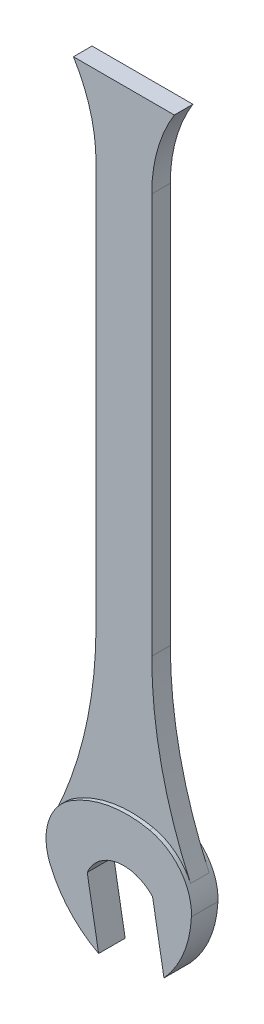
ISO-10303-21;
HEADER;
FILE_DESCRIPTION(('STEP AP214'),'2;1');
FILE_NAME('part.step','',(''),(''),'','','');
FILE_SCHEMA(('AUTOMOTIVE_DESIGN { 1 0 10303 214 1 1 1 1 }'));
ENDSEC;
DATA;
#1=APPLICATION_CONTEXT('core data for automotive mechanical design processes');
#2=APPLICATION_PROTOCOL_DEFINITION('international standard','automotive_design',2000,#1);
#3=PRODUCT_CONTEXT('',#1,'mechanical');
#4=PRODUCT('Part','Part','',(#3));
#5=PRODUCT_RELATED_PRODUCT_CATEGORY('part','',(#4));
#6=PRODUCT_DEFINITION_FORMATION('','',#4);
#7=PRODUCT_DEFINITION_CONTEXT('part definition',#1,'design');
#8=PRODUCT_DEFINITION('design','',#6,#7);
#9=PRODUCT_DEFINITION_SHAPE('','',#8);
#10=(LENGTH_UNIT() NAMED_UNIT(*) SI_UNIT(.MILLI.,.METRE.));
#11=(NAMED_UNIT(*) PLANE_ANGLE_UNIT() SI_UNIT($,.RADIAN.));
#12=(NAMED_UNIT(*) SI_UNIT($,.STERADIAN.) SOLID_ANGLE_UNIT());
#13=UNCERTAINTY_MEASURE_WITH_UNIT(LENGTH_MEASURE(1.E-05),#10,'distance_accuracy_value','');
#14=(GEOMETRIC_REPRESENTATION_CONTEXT(3) GLOBAL_UNCERTAINTY_ASSIGNED_CONTEXT((#13)) GLOBAL_UNIT_ASSIGNED_CONTEXT((#10,
#11,#12)) REPRESENTATION_CONTEXT('',''));
#15=CARTESIAN_POINT('',(0.,0.,0.));
#16=DIRECTION('',(0.,0.,1.));
#17=DIRECTION('',(1.,0.,0.));
#18=AXIS2_PLACEMENT_3D('',#15,#16,#17);
#19=CARTESIAN_POINT('',(-4.97027878571904,0.761707289908329,-3.175));
#20=DIRECTION('',(0.,0.,1.));
#21=DIRECTION('',(1.,0.,0.));
#22=AXIS2_PLACEMENT_3D('',#19,#20,#21);
#23=CYLINDRICAL_SURFACE('',#22,12.7);
#24=CARTESIAN_POINT('',(-4.97027878571904,0.761707289908329,-2.2225));
#25=DIRECTION('',(0.,0.,1.));
#26=DIRECTION('',(1.,0.,0.));
#27=AXIS2_PLACEMENT_3D('',#24,#25,#26);
#28=CIRCLE('',#27,12.7);
#29=CARTESIAN_POINT('',(-16.447747809528,6.19840709838635,-2.2225));
#30=VERTEX_POINT('',#29);
#31=CARTESIAN_POINT('',(-11.7048230565341,11.5290613504207,-2.2225));
#32=VERTEX_POINT('',#31);
#33=EDGE_CURVE('E224',#30,#32,#28,.F.);
#34=ORIENTED_EDGE('',*,*,#33,.T.);
#35=DIRECTION('',(0.,0.,1.));
#36=VECTOR('',#35,1.);
#37=CARTESIAN_POINT('',(-11.7048230565341,11.5290613504207,-3.175));
#38=LINE('',#37,#36);
#39=CARTESIAN_POINT('',(-11.7048230565341,11.5290613504207,-3.175));
#40=VERTEX_POINT('',#39);
#41=EDGE_CURVE('E293',#40,#32,#38,.T.);
#42=ORIENTED_EDGE('',*,*,#41,.F.);
#43=CARTESIAN_POINT('',(-4.97027878571904,0.761707289908329,-3.175));
#44=DIRECTION('',(0.,0.,1.));
#45=DIRECTION('',(1.,0.,0.));
#46=AXIS2_PLACEMENT_3D('',#43,#44,#45);
#47=CIRCLE('',#46,12.7);
#48=CARTESIAN_POINT('',(-16.7007098159735,-4.10522067796262,-3.175));
#49=VERTEX_POINT('',#48);
#50=EDGE_CURVE('E274',#49,#40,#47,.F.);
#51=ORIENTED_EDGE('',*,*,#50,.F.);
#52=DIRECTION('',(0.,0.,1.));
#53=VECTOR('',#52,1.);
#54=CARTESIAN_POINT('',(-16.7007098159735,-4.10522067796262,-3.175));
#55=LINE('',#54,#53);
#56=CARTESIAN_POINT('',(-16.7007098159735,-4.10522067796262,3.175));
#57=VERTEX_POINT('',#56);
#58=EDGE_CURVE('E291',#49,#57,#55,.T.);
#59=ORIENTED_EDGE('',*,*,#58,.T.);
#60=CARTESIAN_POINT('',(-4.97027878571904,0.761707289908329,3.175));
#61=DIRECTION('',(0.,0.,1.));
#62=DIRECTION('',(1.,0.,0.));
#63=AXIS2_PLACEMENT_3D('',#60,#61,#62);
#64=CIRCLE('',#63,12.7);
#65=CARTESIAN_POINT('',(-11.7048230565341,11.5290613504207,3.175));
#66=VERTEX_POINT('',#65);
#67=EDGE_CURVE('E254',#57,#66,#64,.F.);
#68=ORIENTED_EDGE('',*,*,#67,.T.);
#69=CARTESIAN_POINT('',(-11.7048230565341,11.5290613504207,2.2225));
#70=VERTEX_POINT('',#69);
#71=EDGE_CURVE('E295',#70,#66,#38,.T.);
#72=ORIENTED_EDGE('',*,*,#71,.F.);
#73=CARTESIAN_POINT('',(-4.97027878571904,0.761707289908329,2.2225));
#74=DIRECTION('',(0.,0.,1.));
#75=DIRECTION('',(1.,0.,0.));
#76=AXIS2_PLACEMENT_3D('',#73,#74,#75);
#77=CIRCLE('',#76,12.7);
#78=CARTESIAN_POINT('',(-16.447747809528,6.19840709838635,2.2225));
#79=VERTEX_POINT('',#78);
#80=EDGE_CURVE('E206',#79,#70,#77,.F.);
#81=ORIENTED_EDGE('',*,*,#80,.F.);
#82=DIRECTION('',(0.,0.,1.));
#83=VECTOR('',#82,1.);
#84=CARTESIAN_POINT('',(-16.447747809528,6.19840709838635,-2.2225));
#85=LINE('',#84,#83);
#86=EDGE_CURVE('E235',#30,#79,#85,.T.);
#87=ORIENTED_EDGE('',*,*,#86,.F.);
#88=EDGE_LOOP('',(#34,#42,#51,#59,#68,#72,#81,#87));
#89=FACE_BOUND('',#88,.T.);
#90=ADVANCED_FACE('F41',(#89),#23,.T.);
#91=CARTESIAN_POINT('',(1.76426548509602,-10.005646770604,-3.175));
#92=DIRECTION('',(0.,0.,1.));
#93=DIRECTION('',(1.,0.,0.));
#94=AXIS2_PLACEMENT_3D('',#91,#92,#93);
#95=CYLINDRICAL_SURFACE('',#94,25.4);
#96=CARTESIAN_POINT('',(1.76426548509602,-10.005646770604,-2.2225));
#97=DIRECTION('',(0.,0.,1.));
#98=DIRECTION('',(1.,0.,0.));
#99=AXIS2_PLACEMENT_3D('',#96,#97,#98);
#100=CIRCLE('',#99,25.4);
#101=CARTESIAN_POINT('',(7.0557646383485,14.8370591349757,-2.2225));
#102=VERTEX_POINT('',#101);
#103=EDGE_CURVE('E227',#32,#102,#100,.F.);
#104=ORIENTED_EDGE('',*,*,#103,.T.);
#105=DIRECTION('',(0.,0.,1.));
#106=VECTOR('',#105,1.);
#107=CARTESIAN_POINT('',(7.0557646383485,14.8370591349757,-3.175));
#108=LINE('',#107,#106);
#109=CARTESIAN_POINT('',(7.0557646383485,14.8370591349757,-3.175));
#110=VERTEX_POINT('',#109);
#111=EDGE_CURVE('E296',#110,#102,#108,.T.);
#112=ORIENTED_EDGE('',*,*,#111,.F.);
#113=CARTESIAN_POINT('',(1.76426548509602,-10.005646770604,-3.175));
#114=DIRECTION('',(0.,0.,1.));
#115=DIRECTION('',(1.,0.,0.));
#116=AXIS2_PLACEMENT_3D('',#113,#114,#115);
#117=CIRCLE('',#116,25.4);
#118=EDGE_CURVE('E272',#40,#110,#117,.F.);
#119=ORIENTED_EDGE('',*,*,#118,.F.);
#120=ORIENTED_EDGE('',*,*,#41,.T.);
#121=EDGE_LOOP('',(#104,#112,#119,#120));
#122=FACE_BOUND('',#121,.T.);
#123=ADVANCED_FACE('F313',(#122),#95,.T.);
#124=CARTESIAN_POINT('',(4.41001506172227,2.41570618218585,-3.175));
#125=DIRECTION('',(0.,0.,1.));
#126=DIRECTION('',(1.,0.,0.));
#127=AXIS2_PLACEMENT_3D('',#124,#125,#126);
#128=CYLINDRICAL_SURFACE('',#127,12.7);
#129=CARTESIAN_POINT('',(4.41001506172227,2.41570618218585,-2.2225));
#130=DIRECTION('',(0.,0.,1.));
#131=DIRECTION('',(1.,0.,0.));
#132=AXIS2_PLACEMENT_3D('',#129,#130,#131);
#133=CIRCLE('',#132,12.7);
#134=CARTESIAN_POINT('',(15.9497356104198,7.71899286668332,-2.2225));
#135=VERTEX_POINT('',#134);
#136=EDGE_CURVE('E180',#102,#135,#133,.F.);
#137=ORIENTED_EDGE('',*,*,#136,.T.);
#138=DIRECTION('',(0.,0.,1.));
#139=VECTOR('',#138,1.);
#140=CARTESIAN_POINT('',(15.9497356104198,7.71899286668332,-2.2225));
#141=LINE('',#140,#139);
#142=CARTESIAN_POINT('',(15.9497356104198,7.71899286668332,2.2225));
#143=VERTEX_POINT('',#142);
#144=EDGE_CURVE('E232',#135,#143,#141,.T.);
#145=ORIENTED_EDGE('',*,*,#144,.T.);
#146=CARTESIAN_POINT('',(4.41001506172227,2.41570618218585,2.2225));
#147=DIRECTION('',(0.,0.,1.));
#148=DIRECTION('',(1.,0.,0.));
#149=AXIS2_PLACEMENT_3D('',#146,#147,#148);
#150=CIRCLE('',#149,12.7);
#151=CARTESIAN_POINT('',(7.0557646383485,14.8370591349757,2.2225));
#152=VERTEX_POINT('',#151);
#153=EDGE_CURVE('E186',#152,#143,#150,.F.);
#154=ORIENTED_EDGE('',*,*,#153,.F.);
#155=CARTESIAN_POINT('',(7.0557646383485,14.8370591349757,3.175));
#156=VERTEX_POINT('',#155);
#157=EDGE_CURVE('E298',#152,#156,#108,.T.);
#158=ORIENTED_EDGE('',*,*,#157,.T.);
#159=CARTESIAN_POINT('',(4.41001506172227,2.41570618218585,3.175));
#160=DIRECTION('',(0.,0.,1.));
#161=DIRECTION('',(1.,0.,0.));
#162=AXIS2_PLACEMENT_3D('',#159,#160,#161);
#163=CIRCLE('',#162,12.7);
#164=CARTESIAN_POINT('',(17.0976019406173,1.8543335871205,3.175));
#165=VERTEX_POINT('',#164);
#166=EDGE_CURVE('E248',#156,#165,#163,.F.);
#167=ORIENTED_EDGE('',*,*,#166,.T.);
#168=DIRECTION('',(0.,0.,1.));
#169=VECTOR('',#168,1.);
#170=CARTESIAN_POINT('',(17.0976019406173,1.8543335871205,-3.175));
#171=LINE('',#170,#169);
#172=CARTESIAN_POINT('',(17.0976019406173,1.8543335871205,-3.175));
#173=VERTEX_POINT('',#172);
#174=EDGE_CURVE('E45',#173,#165,#171,.T.);
#175=ORIENTED_EDGE('',*,*,#174,.F.);
#176=CARTESIAN_POINT('',(4.41001506172227,2.41570618218585,-3.175));
#177=DIRECTION('',(0.,0.,1.));
#178=DIRECTION('',(1.,0.,0.));
#179=AXIS2_PLACEMENT_3D('',#176,#177,#178);
#180=CIRCLE('',#179,12.7);
#181=EDGE_CURVE('E270',#110,#173,#180,.F.);
#182=ORIENTED_EDGE('',*,*,#181,.F.);
#183=ORIENTED_EDGE('',*,*,#111,.T.);
#184=EDGE_LOOP('',(#137,#145,#154,#158,#167,#175,#182,#183));
#185=FACE_BOUND('',#184,.T.);
#186=ADVANCED_FACE('F311',(#185),#128,.T.);
#187=CARTESIAN_POINT('',(-8.27757181717278,2.97707877725121,-3.175));
#188=DIRECTION('',(0.,0.,1.));
#189=DIRECTION('',(1.,0.,0.));
#190=AXIS2_PLACEMENT_3D('',#187,#188,#189);
#191=CYLINDRICAL_SURFACE('',#190,25.4);
#192=ORIENTED_EDGE('',*,*,#174,.T.);
#193=CARTESIAN_POINT('',(-8.27757181717278,2.97707877725121,3.175));
#194=DIRECTION('',(0.,0.,1.));
#195=DIRECTION('',(1.,0.,0.));
#196=AXIS2_PLACEMENT_3D('',#193,#194,#195);
#197=CIRCLE('',#196,25.4);
#198=CARTESIAN_POINT('',(10.5427017140078,-14.0803918503519,3.175));
#199=VERTEX_POINT('',#198);
#200=EDGE_CURVE('E234',#165,#199,#197,.F.);
#201=ORIENTED_EDGE('',*,*,#200,.T.);
#202=DIRECTION('',(0.,0.,1.));
#203=VECTOR('',#202,1.);
#204=CARTESIAN_POINT('',(10.5427017140078,-14.0803918503519,-3.175));
#205=LINE('',#204,#203);
#206=CARTESIAN_POINT('',(10.5427017140078,-14.0803918503519,-3.175));
#207=VERTEX_POINT('',#206);
#208=EDGE_CURVE('E11',#207,#199,#205,.T.);
#209=ORIENTED_EDGE('',*,*,#208,.F.);
#210=CARTESIAN_POINT('',(-8.27757181717278,2.97707877725121,-3.175));
#211=DIRECTION('',(0.,0.,1.));
#212=DIRECTION('',(1.,0.,0.));
#213=AXIS2_PLACEMENT_3D('',#210,#211,#212);
#214=CIRCLE('',#213,25.4);
#215=EDGE_CURVE('E66',#173,#207,#214,.F.);
#216=ORIENTED_EDGE('',*,*,#215,.F.);
#217=EDGE_LOOP('',(#192,#201,#209,#216));
#218=FACE_BOUND('',#217,.T.);
#219=ADVANCED_FACE('F43',(#218),#191,.T.);
#220=CARTESIAN_POINT('',(7.81691153953437,1.3783324102313,-3.175));
#221=DIRECTION('',(-0.984807753012207,-0.173648177666935,0.));
#222=DIRECTION('',(0.173648177666936,-0.984807753012207,0.));
#223=AXIS2_PLACEMENT_3D('',#220,#221,#222);
#224=PLANE('',#223);
#225=ORIENTED_EDGE('',*,*,#208,.T.);
#226=DIRECTION('',(0.173648177666936,-0.984807753012207,0.));
#227=VECTOR('',#226,1.);
#228=CARTESIAN_POINT('',(7.81691153953437,1.3783324102313,3.175));
#229=LINE('',#228,#227);
#230=CARTESIAN_POINT('',(7.81691153953437,1.37833241023129,3.175));
#231=VERTEX_POINT('',#230);
#232=EDGE_CURVE('E266',#231,#199,#229,.T.);
#233=ORIENTED_EDGE('',*,*,#232,.F.);
#234=DIRECTION('',(0.,0.,1.));
#235=VECTOR('',#234,1.);
#236=CARTESIAN_POINT('',(7.81691153953437,1.37833241023129,-3.175));
#237=LINE('',#236,#235);
#238=CARTESIAN_POINT('',(7.81691153953437,1.37833241023129,-3.175));
#239=VERTEX_POINT('',#238);
#240=EDGE_CURVE('E50',#239,#231,#237,.T.);
#241=ORIENTED_EDGE('',*,*,#240,.F.);
#242=DIRECTION('',(0.173648177666936,-0.984807753012207,0.));
#243=VECTOR('',#242,1.);
#244=CARTESIAN_POINT('',(7.81691153953437,1.3783324102313,-3.175));
#245=LINE('',#244,#243);
#246=EDGE_CURVE('E283',#239,#207,#245,.T.);
#247=ORIENTED_EDGE('',*,*,#246,.T.);
#248=EDGE_LOOP('',(#225,#233,#241,#247));
#249=FACE_BOUND('',#248,.T.);
#250=ADVANCED_FACE('F319',(#249),#224,.T.);
#251=CARTESIAN_POINT('',(0.898225465458729,-5.09408975217372,-3.175));
#252=DIRECTION('',(0.,0.,1.));
#253=DIRECTION('',(1.,0.,0.));
#254=AXIS2_PLACEMENT_3D('',#251,#252,#253);
#255=CYLINDRICAL_SURFACE('',#254,9.47419999999999);
#256=ORIENTED_EDGE('',*,*,#240,.T.);
#257=CARTESIAN_POINT('',(0.898225465458729,-5.09408975217372,3.175));
#258=DIRECTION('',(0.,0.,1.));
#259=DIRECTION('',(1.,0.,0.));
#260=AXIS2_PLACEMENT_3D('',#257,#258,#259);
#261=CIRCLE('',#260,9.47419999999999);
#262=CARTESIAN_POINT('',(-7.8169115395344,-1.37833241023127,3.175));
#263=VERTEX_POINT('',#262);
#264=EDGE_CURVE('E263',#263,#231,#261,.F.);
#265=ORIENTED_EDGE('',*,*,#264,.F.);
#266=DIRECTION('',(0.,0.,1.));
#267=VECTOR('',#266,1.);
#268=CARTESIAN_POINT('',(-7.8169115395344,-1.37833241023127,-3.175));
#269=LINE('',#268,#267);
#270=CARTESIAN_POINT('',(-7.8169115395344,-1.37833241023127,-3.175));
#271=VERTEX_POINT('',#270);
#272=EDGE_CURVE('E287',#271,#263,#269,.T.);
#273=ORIENTED_EDGE('',*,*,#272,.F.);
#274=CARTESIAN_POINT('',(0.898225465458729,-5.09408975217372,-3.175));
#275=DIRECTION('',(0.,0.,1.));
#276=DIRECTION('',(1.,0.,0.));
#277=AXIS2_PLACEMENT_3D('',#274,#275,#276);
#278=CIRCLE('',#277,9.47419999999999);
#279=EDGE_CURVE('E280',#271,#239,#278,.F.);
#280=ORIENTED_EDGE('',*,*,#279,.T.);
#281=EDGE_LOOP('',(#256,#265,#273,#280));
#282=FACE_BOUND('',#281,.T.);
#283=ADVANCED_FACE('F357',(#282),#255,.F.);
#284=CARTESIAN_POINT('',(-7.8169115395344,-1.37833241023128,-3.175));
#285=DIRECTION('',(-0.984807753012208,-0.173648177666932,0.));
#286=DIRECTION('',(0.173648177666932,-0.984807753012208,0.));
#287=AXIS2_PLACEMENT_3D('',#284,#285,#286);
#288=PLANE('',#287);
#289=ORIENTED_EDGE('',*,*,#272,.T.);
#290=DIRECTION('',(0.173648177666932,-0.984807753012208,0.));
#291=VECTOR('',#290,1.);
#292=CARTESIAN_POINT('',(-7.8169115395344,-1.37833241023128,3.175));
#293=LINE('',#292,#291);
#294=CARTESIAN_POINT('',(-5.09112136506103,-16.8370566708145,3.175));
#295=VERTEX_POINT('',#294);
#296=EDGE_CURVE('E260',#263,#295,#293,.T.);
#297=ORIENTED_EDGE('',*,*,#296,.T.);
#298=DIRECTION('',(0.,0.,1.));
#299=VECTOR('',#298,1.);
#300=CARTESIAN_POINT('',(-5.09112136506103,-16.8370566708145,-3.175));
#301=LINE('',#300,#299);
#302=CARTESIAN_POINT('',(-5.09112136506103,-16.8370566708145,-3.175));
#303=VERTEX_POINT('',#302);
#304=EDGE_CURVE('E289',#303,#295,#301,.T.);
#305=ORIENTED_EDGE('',*,*,#304,.F.);
#306=DIRECTION('',(0.173648177666932,-0.984807753012208,0.));
#307=VECTOR('',#306,1.);
#308=CARTESIAN_POINT('',(-7.8169115395344,-1.37833241023128,-3.175));
#309=LINE('',#308,#307);
#310=EDGE_CURVE('E278',#271,#303,#309,.T.);
#311=ORIENTED_EDGE('',*,*,#310,.F.);
#312=EDGE_LOOP('',(#289,#297,#305,#311));
#313=FACE_BOUND('',#312,.T.);
#314=ADVANCED_FACE('F340',(#313),#288,.F.);
#315=CARTESIAN_POINT('',(6.76015224453538,5.62863525777926,-3.175));
#316=DIRECTION('',(0.,0.,1.));
#317=DIRECTION('',(1.,0.,0.));
#318=AXIS2_PLACEMENT_3D('',#315,#316,#317);
#319=CYLINDRICAL_SURFACE('',#318,25.4);
#320=ORIENTED_EDGE('',*,*,#304,.T.);
#321=CARTESIAN_POINT('',(6.76015224453538,5.62863525777926,3.175));
#322=DIRECTION('',(0.,0.,1.));
#323=DIRECTION('',(1.,0.,0.));
#324=AXIS2_PLACEMENT_3D('',#321,#322,#323);
#325=CIRCLE('',#324,25.4);
#326=EDGE_CURVE('E257',#295,#57,#325,.F.);
#327=ORIENTED_EDGE('',*,*,#326,.T.);
#328=ORIENTED_EDGE('',*,*,#58,.F.);
#329=CARTESIAN_POINT('',(6.76015224453538,5.62863525777926,-3.175));
#330=DIRECTION('',(0.,0.,1.));
#331=DIRECTION('',(1.,0.,0.));
#332=AXIS2_PLACEMENT_3D('',#329,#330,#331);
#333=CIRCLE('',#332,25.4);
#334=EDGE_CURVE('E276',#303,#49,#333,.F.);
#335=ORIENTED_EDGE('',*,*,#334,.F.);
#336=EDGE_LOOP('',(#320,#327,#328,#335));
#337=FACE_BOUND('',#336,.T.);
#338=ADVANCED_FACE('F330',(#337),#319,.T.);
#339=ORIENTED_EDGE('',*,*,#157,.F.);
#340=CARTESIAN_POINT('',(1.76426548509602,-10.005646770604,2.2225));
#341=DIRECTION('',(0.,0.,1.));
#342=DIRECTION('',(1.,0.,0.));
#343=AXIS2_PLACEMENT_3D('',#340,#341,#342);
#344=CIRCLE('',#343,25.4);
#345=EDGE_CURVE('E58',#70,#152,#344,.F.);
#346=ORIENTED_EDGE('',*,*,#345,.F.);
#347=ORIENTED_EDGE('',*,*,#71,.T.);
#348=CARTESIAN_POINT('',(1.76426548509602,-10.005646770604,3.175));
#349=DIRECTION('',(0.,0.,1.));
#350=DIRECTION('',(1.,0.,0.));
#351=AXIS2_PLACEMENT_3D('',#348,#349,#350);
#352=CIRCLE('',#351,25.4);
#353=EDGE_CURVE('E251',#66,#156,#352,.F.);
#354=ORIENTED_EDGE('',*,*,#353,.T.);
#355=EDGE_LOOP('',(#339,#346,#347,#354));
#356=FACE_BOUND('',#355,.T.);
#357=ADVANCED_FACE('F322',(#356),#95,.T.);
#358=CARTESIAN_POINT('',(0.,0.,-3.175));
#359=DIRECTION('',(0.,0.,1.));
#360=DIRECTION('',(1.,0.,0.));
#361=AXIS2_PLACEMENT_3D('',#358,#359,#360);
#362=PLANE('',#361);
#363=ORIENTED_EDGE('',*,*,#215,.T.);
#364=ORIENTED_EDGE('',*,*,#246,.F.);
#365=ORIENTED_EDGE('',*,*,#279,.F.);
#366=ORIENTED_EDGE('',*,*,#310,.T.);
#367=ORIENTED_EDGE('',*,*,#334,.T.);
#368=ORIENTED_EDGE('',*,*,#50,.T.);
#369=ORIENTED_EDGE('',*,*,#118,.T.);
#370=ORIENTED_EDGE('',*,*,#181,.T.);
#371=EDGE_LOOP('',(#363,#364,#365,#366,#367,#368,#369,#370));
#372=FACE_BOUND('',#371,.T.);
#373=ADVANCED_FACE('F332',(#372),#362,.F.);
#374=CARTESIAN_POINT('',(0.,0.,3.175));
#375=DIRECTION('',(0.,0.,1.));
#376=DIRECTION('',(1.,0.,0.));
#377=AXIS2_PLACEMENT_3D('',#374,#375,#376);
#378=PLANE('',#377);
#379=ORIENTED_EDGE('',*,*,#200,.F.);
#380=ORIENTED_EDGE('',*,*,#166,.F.);
#381=ORIENTED_EDGE('',*,*,#353,.F.);
#382=ORIENTED_EDGE('',*,*,#67,.F.);
#383=ORIENTED_EDGE('',*,*,#326,.F.);
#384=ORIENTED_EDGE('',*,*,#296,.F.);
#385=ORIENTED_EDGE('',*,*,#264,.T.);
#386=ORIENTED_EDGE('',*,*,#232,.T.);
#387=EDGE_LOOP('',(#379,#380,#381,#382,#383,#384,#385,#386));
#388=FACE_BOUND('',#387,.T.);
#389=ADVANCED_FACE('F308',(#388),#378,.T.);
#390=CARTESIAN_POINT('',(108.2675,50.145286342663,-2.2225));
#391=DIRECTION('',(0.,0.,1.));
#392=DIRECTION('',(1.,0.,0.));
#393=AXIS2_PLACEMENT_3D('',#390,#391,#392);
#394=CYLINDRICAL_SURFACE('',#393,101.6);
#395=DIRECTION('',(0.,0.,1.));
#396=VECTOR('',#395,1.);
#397=CARTESIAN_POINT('',(6.66749999999999,50.145286342663,-2.2225));
#398=LINE('',#397,#396);
#399=CARTESIAN_POINT('',(6.66749999999999,50.145286342663,-2.2225));
#400=VERTEX_POINT('',#399);
#401=CARTESIAN_POINT('',(6.66749999999999,50.145286342663,2.2225));
#402=VERTEX_POINT('',#401);
#403=EDGE_CURVE('E169',#400,#402,#398,.T.);
#404=ORIENTED_EDGE('',*,*,#403,.T.);
#405=CARTESIAN_POINT('',(108.2675,50.145286342663,2.2225));
#406=DIRECTION('',(0.,0.,1.));
#407=DIRECTION('',(1.,0.,0.));
#408=AXIS2_PLACEMENT_3D('',#405,#406,#407);
#409=CIRCLE('',#408,101.6);
#410=EDGE_CURVE('E173',#402,#143,#409,.T.);
#411=ORIENTED_EDGE('',*,*,#410,.T.);
#412=ORIENTED_EDGE('',*,*,#144,.F.);
#413=CARTESIAN_POINT('',(108.2675,50.145286342663,-2.2225));
#414=DIRECTION('',(0.,0.,1.));
#415=DIRECTION('',(1.,0.,0.));
#416=AXIS2_PLACEMENT_3D('',#413,#414,#415);
#417=CIRCLE('',#416,101.6);
#418=EDGE_CURVE('E175',#400,#135,#417,.T.);
#419=ORIENTED_EDGE('',*,*,#418,.F.);
#420=EDGE_LOOP('',(#404,#411,#412,#419));
#421=FACE_BOUND('',#420,.T.);
#422=ADVANCED_FACE('F171',(#421),#394,.F.);
#423=CARTESIAN_POINT('',(-108.2675,49.6920055662105,-2.2225));
#424=DIRECTION('',(0.,0.,1.));
#425=DIRECTION('',(1.,0.,0.));
#426=AXIS2_PLACEMENT_3D('',#423,#424,#425);
#427=CYLINDRICAL_SURFACE('',#426,101.6);
#428=ORIENTED_EDGE('',*,*,#86,.T.);
#429=CARTESIAN_POINT('',(-108.2675,49.6920055662105,2.2225));
#430=DIRECTION('',(0.,0.,1.));
#431=DIRECTION('',(1.,0.,0.));
#432=AXIS2_PLACEMENT_3D('',#429,#430,#431);
#433=CIRCLE('',#432,101.6);
#434=CARTESIAN_POINT('',(-6.6675,49.6920055662105,2.2225));
#435=VERTEX_POINT('',#434);
#436=EDGE_CURVE('E203',#79,#435,#433,.T.);
#437=ORIENTED_EDGE('',*,*,#436,.T.);
#438=DIRECTION('',(0.,0.,1.));
#439=VECTOR('',#438,1.);
#440=CARTESIAN_POINT('',(-6.6675,49.6920055662105,-2.2225));
#441=LINE('',#440,#439);
#442=CARTESIAN_POINT('',(-6.6675,49.6920055662105,-2.2225));
#443=VERTEX_POINT('',#442);
#444=EDGE_CURVE('E237',#443,#435,#441,.T.);
#445=ORIENTED_EDGE('',*,*,#444,.F.);
#446=CARTESIAN_POINT('',(-108.2675,49.6920055662105,-2.2225));
#447=DIRECTION('',(0.,0.,1.));
#448=DIRECTION('',(1.,0.,0.));
#449=AXIS2_PLACEMENT_3D('',#446,#447,#448);
#450=CIRCLE('',#449,101.6);
#451=EDGE_CURVE('E222',#30,#443,#450,.T.);
#452=ORIENTED_EDGE('',*,*,#451,.F.);
#453=EDGE_LOOP('',(#428,#437,#445,#452));
#454=FACE_BOUND('',#453,.T.);
#455=ADVANCED_FACE('F385',(#454),#427,.F.);
#456=CARTESIAN_POINT('',(-6.6675,0.,-2.2225));
#457=DIRECTION('',(1.,0.,0.));
#458=DIRECTION('',(0.,0.,-1.));
#459=AXIS2_PLACEMENT_3D('',#456,#457,#458);
#460=PLANE('',#459);
#461=ORIENTED_EDGE('',*,*,#444,.T.);
#462=DIRECTION('',(0.,1.,0.));
#463=VECTOR('',#462,1.);
#464=CARTESIAN_POINT('',(-6.6675,0.,2.2225));
#465=LINE('',#464,#463);
#466=CARTESIAN_POINT('',(-6.6675,145.898407098386,2.2225));
#467=VERTEX_POINT('',#466);
#468=EDGE_CURVE('E200',#435,#467,#465,.T.);
#469=ORIENTED_EDGE('',*,*,#468,.T.);
#470=DIRECTION('',(0.,0.,1.));
#471=VECTOR('',#470,1.);
#472=CARTESIAN_POINT('',(-6.6675,145.898407098386,-2.2225));
#473=LINE('',#472,#471);
#474=CARTESIAN_POINT('',(-6.6675,145.898407098386,-2.2225));
#475=VERTEX_POINT('',#474);
#476=EDGE_CURVE('E239',#475,#467,#473,.T.);
#477=ORIENTED_EDGE('',*,*,#476,.F.);
#478=DIRECTION('',(0.,1.,0.));
#479=VECTOR('',#478,1.);
#480=CARTESIAN_POINT('',(-6.6675,0.,-2.2225));
#481=LINE('',#480,#479);
#482=EDGE_CURVE('E220',#443,#475,#481,.T.);
#483=ORIENTED_EDGE('',*,*,#482,.F.);
#484=EDGE_LOOP('',(#461,#469,#477,#483));
#485=FACE_BOUND('',#484,.T.);
#486=ADVANCED_FACE('F381',(#485),#460,.F.);
#487=CARTESIAN_POINT('',(-42.9838970588236,145.898407098386,-2.2225));
#488=DIRECTION('',(0.,0.,1.));
#489=DIRECTION('',(1.,0.,0.));
#490=AXIS2_PLACEMENT_3D('',#487,#488,#489);
#491=CYLINDRICAL_SURFACE('',#490,36.3163970588236);
#492=ORIENTED_EDGE('',*,*,#476,.T.);
#493=CARTESIAN_POINT('',(-42.9838970588236,145.898407098386,2.2225));
#494=DIRECTION('',(0.,0.,1.));
#495=DIRECTION('',(1.,0.,0.));
#496=AXIS2_PLACEMENT_3D('',#493,#494,#495);
#497=CIRCLE('',#496,36.3163970588236);
#498=CARTESIAN_POINT('',(-12.065,164.948407098386,2.2225));
#499=VERTEX_POINT('',#498);
#500=EDGE_CURVE('E197',#467,#499,#497,.T.);
#501=ORIENTED_EDGE('',*,*,#500,.T.);
#502=DIRECTION('',(0.,0.,1.));
#503=VECTOR('',#502,1.);
#504=CARTESIAN_POINT('',(-12.065,164.948407098386,-2.2225));
#505=LINE('',#504,#503);
#506=CARTESIAN_POINT('',(-12.065,164.948407098386,-2.2225));
#507=VERTEX_POINT('',#506);
#508=EDGE_CURVE('E241',#507,#499,#505,.T.);
#509=ORIENTED_EDGE('',*,*,#508,.F.);
#510=CARTESIAN_POINT('',(-42.9838970588236,145.898407098386,-2.2225));
#511=DIRECTION('',(0.,0.,1.));
#512=DIRECTION('',(1.,0.,0.));
#513=AXIS2_PLACEMENT_3D('',#510,#511,#512);
#514=CIRCLE('',#513,36.3163970588236);
#515=EDGE_CURVE('E218',#475,#507,#514,.T.);
#516=ORIENTED_EDGE('',*,*,#515,.F.);
#517=EDGE_LOOP('',(#492,#501,#509,#516));
#518=FACE_BOUND('',#517,.T.);
#519=ADVANCED_FACE('F376',(#518),#491,.F.);
#520=CARTESIAN_POINT('',(0.,164.948407098386,-2.2225));
#521=DIRECTION('',(0.,-1.,0.));
#522=DIRECTION('',(0.,0.,-1.));
#523=AXIS2_PLACEMENT_3D('',#520,#521,#522);
#524=PLANE('',#523);
#525=ORIENTED_EDGE('',*,*,#508,.T.);
#526=DIRECTION('',(1.,0.,0.));
#527=VECTOR('',#526,1.);
#528=CARTESIAN_POINT('',(0.,164.948407098386,2.2225));
#529=LINE('',#528,#527);
#530=CARTESIAN_POINT('',(12.065,164.948407098386,2.2225));
#531=VERTEX_POINT('',#530);
#532=EDGE_CURVE('E192',#499,#531,#529,.T.);
#533=ORIENTED_EDGE('',*,*,#532,.T.);
#534=DIRECTION('',(0.,0.,1.));
#535=VECTOR('',#534,1.);
#536=CARTESIAN_POINT('',(12.065,164.948407098386,-2.2225));
#537=LINE('',#536,#535);
#538=CARTESIAN_POINT('',(12.065,164.948407098386,-2.2225));
#539=VERTEX_POINT('',#538);
#540=EDGE_CURVE('E243',#539,#531,#537,.T.);
#541=ORIENTED_EDGE('',*,*,#540,.F.);
#542=DIRECTION('',(1.,0.,0.));
#543=VECTOR('',#542,1.);
#544=CARTESIAN_POINT('',(0.,164.948407098386,-2.2225));
#545=LINE('',#544,#543);
#546=EDGE_CURVE('E216',#507,#539,#545,.T.);
#547=ORIENTED_EDGE('',*,*,#546,.F.);
#548=EDGE_LOOP('',(#525,#533,#541,#547));
#549=FACE_BOUND('',#548,.T.);
#550=ADVANCED_FACE('F372',(#549),#524,.F.);
#551=CARTESIAN_POINT('',(42.9838970588236,145.898407098386,-2.2225));
#552=DIRECTION('',(0.,0.,1.));
#553=DIRECTION('',(1.,0.,0.));
#554=AXIS2_PLACEMENT_3D('',#551,#552,#553);
#555=CYLINDRICAL_SURFACE('',#554,36.3163970588236);
#556=ORIENTED_EDGE('',*,*,#540,.T.);
#557=CARTESIAN_POINT('',(42.9838970588236,145.898407098386,2.2225));
#558=DIRECTION('',(0.,0.,1.));
#559=DIRECTION('',(1.,0.,0.));
#560=AXIS2_PLACEMENT_3D('',#557,#558,#559);
#561=CIRCLE('',#560,36.3163970588236);
#562=CARTESIAN_POINT('',(6.6675,145.898407098386,2.2225));
#563=VERTEX_POINT('',#562);
#564=EDGE_CURVE('E190',#563,#531,#561,.F.);
#565=ORIENTED_EDGE('',*,*,#564,.F.);
#566=DIRECTION('',(0.,0.,1.));
#567=VECTOR('',#566,1.);
#568=CARTESIAN_POINT('',(6.6675,145.898407098386,-2.2225));
#569=LINE('',#568,#567);
#570=CARTESIAN_POINT('',(6.6675,145.898407098386,-2.2225));
#571=VERTEX_POINT('',#570);
#572=EDGE_CURVE('E179',#571,#563,#569,.T.);
#573=ORIENTED_EDGE('',*,*,#572,.F.);
#574=CARTESIAN_POINT('',(42.9838970588236,145.898407098386,-2.2225));
#575=DIRECTION('',(0.,0.,1.));
#576=DIRECTION('',(1.,0.,0.));
#577=AXIS2_PLACEMENT_3D('',#574,#575,#576);
#578=CIRCLE('',#577,36.3163970588236);
#579=EDGE_CURVE('E213',#571,#539,#578,.F.);
#580=ORIENTED_EDGE('',*,*,#579,.T.);
#581=EDGE_LOOP('',(#556,#565,#573,#580));
#582=FACE_BOUND('',#581,.T.);
#583=ADVANCED_FACE('F368',(#582),#555,.F.);
#584=CARTESIAN_POINT('',(6.66749999999999,0.,-2.2225));
#585=DIRECTION('',(-1.,0.,0.));
#586=DIRECTION('',(0.,-1.,0.));
#587=AXIS2_PLACEMENT_3D('',#584,#585,#586);
#588=PLANE('',#587);
#589=ORIENTED_EDGE('',*,*,#572,.T.);
#590=DIRECTION('',(0.,-1.,0.));
#591=VECTOR('',#590,1.);
#592=CARTESIAN_POINT('',(6.66749999999999,0.,2.2225));
#593=LINE('',#592,#591);
#594=EDGE_CURVE('E185',#563,#402,#593,.T.);
#595=ORIENTED_EDGE('',*,*,#594,.T.);
#596=ORIENTED_EDGE('',*,*,#403,.F.);
#597=DIRECTION('',(0.,-1.,0.));
#598=VECTOR('',#597,1.);
#599=CARTESIAN_POINT('',(6.66749999999999,0.,-2.2225));
#600=LINE('',#599,#598);
#601=EDGE_CURVE('E211',#571,#400,#600,.T.);
#602=ORIENTED_EDGE('',*,*,#601,.F.);
#603=EDGE_LOOP('',(#589,#595,#596,#602));
#604=FACE_BOUND('',#603,.T.);
#605=ADVANCED_FACE('F188',(#604),#588,.F.);
#606=CARTESIAN_POINT('',(0.,0.,-2.2225));
#607=DIRECTION('',(0.,0.,1.));
#608=DIRECTION('',(1.,0.,0.));
#609=AXIS2_PLACEMENT_3D('',#606,#607,#608);
#610=PLANE('',#609);
#611=ORIENTED_EDGE('',*,*,#418,.T.);
#612=ORIENTED_EDGE('',*,*,#136,.F.);
#613=ORIENTED_EDGE('',*,*,#103,.F.);
#614=ORIENTED_EDGE('',*,*,#33,.F.);
#615=ORIENTED_EDGE('',*,*,#451,.T.);
#616=ORIENTED_EDGE('',*,*,#482,.T.);
#617=ORIENTED_EDGE('',*,*,#515,.T.);
#618=ORIENTED_EDGE('',*,*,#546,.T.);
#619=ORIENTED_EDGE('',*,*,#579,.F.);
#620=ORIENTED_EDGE('',*,*,#601,.T.);
#621=EDGE_LOOP('',(#611,#612,#613,#614,#615,#616,#617,#618,#619,#620));
#622=FACE_BOUND('',#621,.T.);
#623=ADVANCED_FACE('F363',(#622),#610,.F.);
#624=CARTESIAN_POINT('',(0.,0.,2.2225));
#625=DIRECTION('',(0.,0.,1.));
#626=DIRECTION('',(1.,0.,0.));
#627=AXIS2_PLACEMENT_3D('',#624,#625,#626);
#628=PLANE('',#627);
#629=ORIENTED_EDGE('',*,*,#410,.F.);
#630=ORIENTED_EDGE('',*,*,#594,.F.);
#631=ORIENTED_EDGE('',*,*,#564,.T.);
#632=ORIENTED_EDGE('',*,*,#532,.F.);
#633=ORIENTED_EDGE('',*,*,#500,.F.);
#634=ORIENTED_EDGE('',*,*,#468,.F.);
#635=ORIENTED_EDGE('',*,*,#436,.F.);
#636=ORIENTED_EDGE('',*,*,#80,.T.);
#637=ORIENTED_EDGE('',*,*,#345,.T.);
#638=ORIENTED_EDGE('',*,*,#153,.T.);
#639=EDGE_LOOP('',(#629,#630,#631,#632,#633,#634,#635,#636,#637,#638));
#640=FACE_BOUND('',#639,.T.);
#641=ADVANCED_FACE('F183',(#640),#628,.T.);
#642=CLOSED_SHELL('',(#90,#123,#186,#219,#250,#283,#314,#338,#357,#373,#389,#422,#455,#486,#519,
#550,#583,#605,#623,#641));
#643=MANIFOLD_SOLID_BREP('B2',#642);
#644=ADVANCED_BREP_SHAPE_REPRESENTATION('',(#18,#643),#14);
#645=SHAPE_DEFINITION_REPRESENTATION(#9,#644);
ENDSEC;
END-ISO-10303-21;
